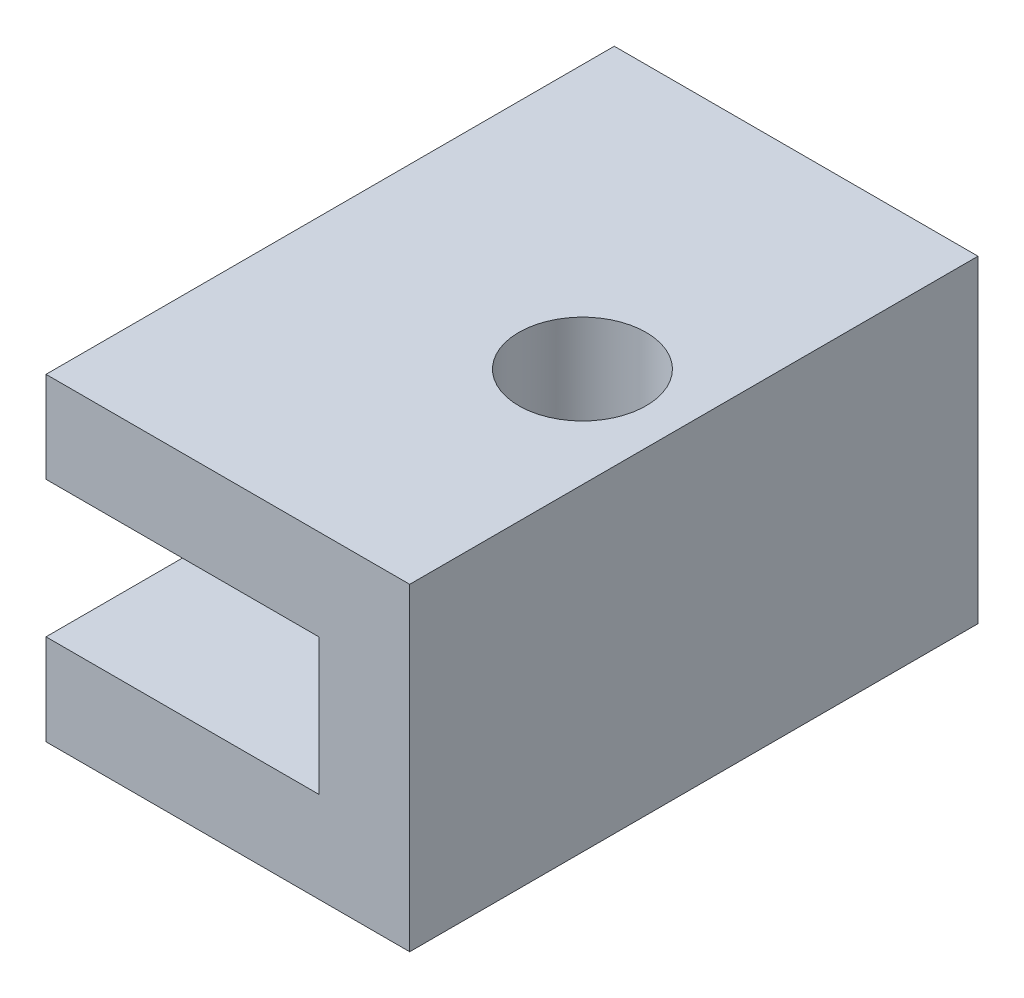
ISO-10303-21;
HEADER;
FILE_DESCRIPTION(('STEP AP214'),'2;1');
FILE_NAME('part.step','',(''),(''),'','','');
FILE_SCHEMA(('AUTOMOTIVE_DESIGN { 1 0 10303 214 1 1 1 1 }'));
ENDSEC;
DATA;
#1=APPLICATION_CONTEXT('core data for automotive mechanical design processes');
#2=APPLICATION_PROTOCOL_DEFINITION('international standard','automotive_design',2000,#1);
#3=PRODUCT_CONTEXT('',#1,'mechanical');
#4=PRODUCT('Part','Part','',(#3));
#5=PRODUCT_RELATED_PRODUCT_CATEGORY('part','',(#4));
#6=PRODUCT_DEFINITION_FORMATION('','',#4);
#7=PRODUCT_DEFINITION_CONTEXT('part definition',#1,'design');
#8=PRODUCT_DEFINITION('design','',#6,#7);
#9=PRODUCT_DEFINITION_SHAPE('','',#8);
#10=(LENGTH_UNIT() NAMED_UNIT(*) SI_UNIT(.MILLI.,.METRE.));
#11=(NAMED_UNIT(*) PLANE_ANGLE_UNIT() SI_UNIT($,.RADIAN.));
#12=(NAMED_UNIT(*) SI_UNIT($,.STERADIAN.) SOLID_ANGLE_UNIT());
#13=UNCERTAINTY_MEASURE_WITH_UNIT(LENGTH_MEASURE(1.E-05),#10,'distance_accuracy_value','');
#14=(GEOMETRIC_REPRESENTATION_CONTEXT(3) GLOBAL_UNCERTAINTY_ASSIGNED_CONTEXT((#13)) GLOBAL_UNIT_ASSIGNED_CONTEXT((#10,
#11,#12)) REPRESENTATION_CONTEXT('',''));
#15=CARTESIAN_POINT('',(0.,0.,0.));
#16=DIRECTION('',(0.,0.,1.));
#17=DIRECTION('',(1.,0.,0.));
#18=AXIS2_PLACEMENT_3D('',#15,#16,#17);
#19=CARTESIAN_POINT('',(6.,5.,12.5));
#20=DIRECTION('',(1.,0.,0.));
#21=DIRECTION('',(0.,0.,-1.));
#22=AXIS2_PLACEMENT_3D('',#19,#20,#21);
#23=PLANE('',#22);
#24=DIRECTION('',(0.,0.,-1.));
#25=VECTOR('',#24,1.);
#26=CARTESIAN_POINT('',(6.,2.,12.5));
#27=LINE('',#26,#25);
#28=CARTESIAN_POINT('',(6.,2.,5.1143593539449));
#29=VERTEX_POINT('',#28);
#30=CARTESIAN_POINT('',(6.,2.,0.));
#31=VERTEX_POINT('',#30);
#32=EDGE_CURVE('E164',#29,#31,#27,.T.);
#33=ORIENTED_EDGE('',*,*,#32,.F.);
#34=DIRECTION('',(0.,1.,0.));
#35=VECTOR('',#34,1.);
#36=CARTESIAN_POINT('',(6.,0.,5.1143593539449));
#37=LINE('',#36,#35);
#38=CARTESIAN_POINT('',(6.,5.,5.1143593539449));
#39=VERTEX_POINT('',#38);
#40=EDGE_CURVE('E48',#29,#39,#37,.T.);
#41=ORIENTED_EDGE('',*,*,#40,.T.);
#42=DIRECTION('',(0.,0.,-1.));
#43=VECTOR('',#42,1.);
#44=CARTESIAN_POINT('',(6.,5.,12.5));
#45=LINE('',#44,#43);
#46=CARTESIAN_POINT('',(6.,5.,0.));
#47=VERTEX_POINT('',#46);
#48=EDGE_CURVE('E134',#39,#47,#45,.T.);
#49=ORIENTED_EDGE('',*,*,#48,.T.);
#50=DIRECTION('',(0.,-1.,0.));
#51=VECTOR('',#50,1.);
#52=CARTESIAN_POINT('',(6.,5.,0.));
#53=LINE('',#52,#51);
#54=EDGE_CURVE('E158',#47,#31,#53,.T.);
#55=ORIENTED_EDGE('',*,*,#54,.T.);
#56=EDGE_LOOP('',(#33,#41,#49,#55));
#57=FACE_BOUND('',#56,.T.);
#58=ADVANCED_FACE('F33',(#57),#23,.F.);
#59=CARTESIAN_POINT('',(0.,2.,12.5));
#60=DIRECTION('',(1.,0.,0.));
#61=DIRECTION('',(0.,1.,0.));
#62=AXIS2_PLACEMENT_3D('',#59,#60,#61);
#63=PLANE('',#62);
#64=DIRECTION('',(0.,-1.,0.));
#65=VECTOR('',#64,1.);
#66=CARTESIAN_POINT('',(0.,2.,0.));
#67=LINE('',#66,#65);
#68=CARTESIAN_POINT('',(0.,2.,0.));
#69=VERTEX_POINT('',#68);
#70=CARTESIAN_POINT('',(0.,0.,0.));
#71=VERTEX_POINT('',#70);
#72=EDGE_CURVE('E144',#69,#71,#67,.T.);
#73=ORIENTED_EDGE('',*,*,#72,.T.);
#74=DIRECTION('',(0.,0.,-1.));
#75=VECTOR('',#74,1.);
#76=CARTESIAN_POINT('',(0.,0.,12.5));
#77=LINE('',#76,#75);
#78=CARTESIAN_POINT('',(0.,0.,12.5));
#79=VERTEX_POINT('',#78);
#80=EDGE_CURVE('E41',#79,#71,#77,.T.);
#81=ORIENTED_EDGE('',*,*,#80,.F.);
#82=DIRECTION('',(0.,-1.,0.));
#83=VECTOR('',#82,1.);
#84=CARTESIAN_POINT('',(0.,2.,12.5));
#85=LINE('',#84,#83);
#86=CARTESIAN_POINT('',(0.,2.,12.5));
#87=VERTEX_POINT('',#86);
#88=EDGE_CURVE('E162',#87,#79,#85,.T.);
#89=ORIENTED_EDGE('',*,*,#88,.F.);
#90=DIRECTION('',(0.,0.,-1.));
#91=VECTOR('',#90,1.);
#92=CARTESIAN_POINT('',(0.,2.,12.5));
#93=LINE('',#92,#91);
#94=EDGE_CURVE('E140',#87,#69,#93,.T.);
#95=ORIENTED_EDGE('',*,*,#94,.T.);
#96=EDGE_LOOP('',(#73,#81,#89,#95));
#97=FACE_BOUND('',#96,.T.);
#98=ADVANCED_FACE('F35',(#97),#63,.F.);
#99=CARTESIAN_POINT('',(0.,0.,12.5));
#100=DIRECTION('',(0.,1.,0.));
#101=DIRECTION('',(0.,0.,1.));
#102=AXIS2_PLACEMENT_3D('',#99,#100,#101);
#103=PLANE('',#102);
#104=CARTESIAN_POINT('',(5.79999999999999,0.,6.5));
#105=DIRECTION('',(0.,1.,0.));
#106=DIRECTION('',(-1.,0.,0.));
#107=AXIS2_PLACEMENT_3D('',#104,#105,#106);
#108=CIRCLE('',#107,1.4);
#109=CARTESIAN_POINT('',(4.39999999999999,0.,6.5));
#110=VERTEX_POINT('',#109);
#111=EDGE_CURVE('E205',#110,#110,#108,.T.);
#112=ORIENTED_EDGE('',*,*,#111,.T.);
#113=EDGE_LOOP('',(#112));
#114=FACE_BOUND('',#113,.T.);
#115=DIRECTION('',(1.,0.,0.));
#116=VECTOR('',#115,1.);
#117=CARTESIAN_POINT('',(0.,0.,0.));
#118=LINE('',#117,#116);
#119=CARTESIAN_POINT('',(8.,0.,0.));
#120=VERTEX_POINT('',#119);
#121=EDGE_CURVE('E147',#71,#120,#118,.T.);
#122=ORIENTED_EDGE('',*,*,#121,.T.);
#123=DIRECTION('',(0.,0.,-1.));
#124=VECTOR('',#123,1.);
#125=CARTESIAN_POINT('',(8.,0.,12.5));
#126=LINE('',#125,#124);
#127=CARTESIAN_POINT('',(8.,0.,12.5));
#128=VERTEX_POINT('',#127);
#129=EDGE_CURVE('E173',#128,#120,#126,.T.);
#130=ORIENTED_EDGE('',*,*,#129,.F.);
#131=DIRECTION('',(1.,0.,0.));
#132=VECTOR('',#131,1.);
#133=CARTESIAN_POINT('',(0.,0.,12.5));
#134=LINE('',#133,#132);
#135=EDGE_CURVE('E97',#79,#128,#134,.T.);
#136=ORIENTED_EDGE('',*,*,#135,.F.);
#137=ORIENTED_EDGE('',*,*,#80,.T.);
#138=EDGE_LOOP('',(#122,#130,#136,#137));
#139=FACE_BOUND('',#138,.T.);
#140=ADVANCED_FACE('F176',(#114,#139),#103,.F.);
#141=CARTESIAN_POINT('',(8.,0.,12.5));
#142=DIRECTION('',(-1.,0.,0.));
#143=DIRECTION('',(0.,-1.,0.));
#144=AXIS2_PLACEMENT_3D('',#141,#142,#143);
#145=PLANE('',#144);
#146=DIRECTION('',(0.,1.,0.));
#147=VECTOR('',#146,1.);
#148=CARTESIAN_POINT('',(8.,0.,0.));
#149=LINE('',#148,#147);
#150=CARTESIAN_POINT('',(8.,7.,0.));
#151=VERTEX_POINT('',#150);
#152=EDGE_CURVE('E149',#120,#151,#149,.T.);
#153=ORIENTED_EDGE('',*,*,#152,.T.);
#154=DIRECTION('',(0.,0.,-1.));
#155=VECTOR('',#154,1.);
#156=CARTESIAN_POINT('',(8.,7.,12.5));
#157=LINE('',#156,#155);
#158=CARTESIAN_POINT('',(8.,7.,12.5));
#159=VERTEX_POINT('',#158);
#160=EDGE_CURVE('E170',#159,#151,#157,.T.);
#161=ORIENTED_EDGE('',*,*,#160,.F.);
#162=DIRECTION('',(0.,1.,0.));
#163=VECTOR('',#162,1.);
#164=CARTESIAN_POINT('',(8.,0.,12.5));
#165=LINE('',#164,#163);
#166=EDGE_CURVE('E195',#128,#159,#165,.T.);
#167=ORIENTED_EDGE('',*,*,#166,.F.);
#168=ORIENTED_EDGE('',*,*,#129,.T.);
#169=EDGE_LOOP('',(#153,#161,#167,#168));
#170=FACE_BOUND('',#169,.T.);
#171=ADVANCED_FACE('F188',(#170),#145,.F.);
#172=CARTESIAN_POINT('',(8.,7.,12.5));
#173=DIRECTION('',(0.,-1.,0.));
#174=DIRECTION('',(1.,0.,0.));
#175=AXIS2_PLACEMENT_3D('',#172,#173,#174);
#176=PLANE('',#175);
#177=CARTESIAN_POINT('',(5.79999999999999,7.,6.5));
#178=DIRECTION('',(0.,1.,0.));
#179=DIRECTION('',(-1.,0.,0.));
#180=AXIS2_PLACEMENT_3D('',#177,#178,#179);
#181=CIRCLE('',#180,1.4);
#182=CARTESIAN_POINT('',(4.39999999999999,7.,6.5));
#183=VERTEX_POINT('',#182);
#184=EDGE_CURVE('E206',#183,#183,#181,.T.);
#185=ORIENTED_EDGE('',*,*,#184,.F.);
#186=EDGE_LOOP('',(#185));
#187=FACE_BOUND('',#186,.T.);
#188=DIRECTION('',(-1.,0.,0.));
#189=VECTOR('',#188,1.);
#190=CARTESIAN_POINT('',(8.,7.,0.));
#191=LINE('',#190,#189);
#192=CARTESIAN_POINT('',(0.,7.,0.));
#193=VERTEX_POINT('',#192);
#194=EDGE_CURVE('E151',#151,#193,#191,.T.);
#195=ORIENTED_EDGE('',*,*,#194,.T.);
#196=DIRECTION('',(0.,0.,-1.));
#197=VECTOR('',#196,1.);
#198=CARTESIAN_POINT('',(0.,7.,12.5));
#199=LINE('',#198,#197);
#200=CARTESIAN_POINT('',(0.,7.,12.5));
#201=VERTEX_POINT('',#200);
#202=EDGE_CURVE('E167',#201,#193,#199,.T.);
#203=ORIENTED_EDGE('',*,*,#202,.F.);
#204=DIRECTION('',(-1.,0.,0.));
#205=VECTOR('',#204,1.);
#206=CARTESIAN_POINT('',(8.,7.,12.5));
#207=LINE('',#206,#205);
#208=EDGE_CURVE('E194',#159,#201,#207,.T.);
#209=ORIENTED_EDGE('',*,*,#208,.F.);
#210=ORIENTED_EDGE('',*,*,#160,.T.);
#211=EDGE_LOOP('',(#195,#203,#209,#210));
#212=FACE_BOUND('',#211,.T.);
#213=ADVANCED_FACE('F192',(#187,#212),#176,.F.);
#214=CARTESIAN_POINT('',(0.,7.,12.5));
#215=DIRECTION('',(1.,0.,0.));
#216=DIRECTION('',(0.,1.,0.));
#217=AXIS2_PLACEMENT_3D('',#214,#215,#216);
#218=PLANE('',#217);
#219=DIRECTION('',(0.,-1.,0.));
#220=VECTOR('',#219,1.);
#221=CARTESIAN_POINT('',(0.,7.,0.));
#222=LINE('',#221,#220);
#223=CARTESIAN_POINT('',(0.,5.,0.));
#224=VERTEX_POINT('',#223);
#225=EDGE_CURVE('E153',#193,#224,#222,.T.);
#226=ORIENTED_EDGE('',*,*,#225,.T.);
#227=DIRECTION('',(0.,0.,-1.));
#228=VECTOR('',#227,1.);
#229=CARTESIAN_POINT('',(0.,5.,12.5));
#230=LINE('',#229,#228);
#231=CARTESIAN_POINT('',(0.,5.,12.5));
#232=VERTEX_POINT('',#231);
#233=EDGE_CURVE('E133',#232,#224,#230,.T.);
#234=ORIENTED_EDGE('',*,*,#233,.F.);
#235=DIRECTION('',(0.,-1.,0.));
#236=VECTOR('',#235,1.);
#237=CARTESIAN_POINT('',(0.,7.,12.5));
#238=LINE('',#237,#236);
#239=EDGE_CURVE('E119',#201,#232,#238,.T.);
#240=ORIENTED_EDGE('',*,*,#239,.F.);
#241=ORIENTED_EDGE('',*,*,#202,.T.);
#242=EDGE_LOOP('',(#226,#234,#240,#241));
#243=FACE_BOUND('',#242,.T.);
#244=ADVANCED_FACE('F220',(#243),#218,.F.);
#245=CARTESIAN_POINT('',(0.,5.,12.5));
#246=DIRECTION('',(0.,1.,0.));
#247=DIRECTION('',(0.,0.,1.));
#248=AXIS2_PLACEMENT_3D('',#245,#246,#247);
#249=PLANE('',#248);
#250=ORIENTED_EDGE('',*,*,#48,.F.);
#251=CARTESIAN_POINT('',(5.79999999999999,5.,6.5));
#252=DIRECTION('',(0.,1.,0.));
#253=DIRECTION('',(0.,0.,1.));
#254=AXIS2_PLACEMENT_3D('',#251,#252,#253);
#255=CIRCLE('',#254,1.4);
#256=CARTESIAN_POINT('',(6.,5.,7.8856406460551));
#257=VERTEX_POINT('',#256);
#258=EDGE_CURVE('E130',#39,#257,#255,.T.);
#259=ORIENTED_EDGE('',*,*,#258,.T.);
#260=CARTESIAN_POINT('',(6.,5.,12.5));
#261=VERTEX_POINT('',#260);
#262=EDGE_CURVE('E126',#261,#257,#45,.T.);
#263=ORIENTED_EDGE('',*,*,#262,.F.);
#264=DIRECTION('',(1.,0.,0.));
#265=VECTOR('',#264,1.);
#266=CARTESIAN_POINT('',(0.,5.,12.5));
#267=LINE('',#266,#265);
#268=EDGE_CURVE('E112',#232,#261,#267,.T.);
#269=ORIENTED_EDGE('',*,*,#268,.F.);
#270=ORIENTED_EDGE('',*,*,#233,.T.);
#271=DIRECTION('',(1.,0.,0.));
#272=VECTOR('',#271,1.);
#273=CARTESIAN_POINT('',(0.,5.,0.));
#274=LINE('',#273,#272);
#275=EDGE_CURVE('E155',#224,#47,#274,.T.);
#276=ORIENTED_EDGE('',*,*,#275,.T.);
#277=EDGE_LOOP('',(#250,#259,#263,#269,#270,#276));
#278=FACE_BOUND('',#277,.T.);
#279=ADVANCED_FACE('F128',(#278),#249,.F.);
#280=ORIENTED_EDGE('',*,*,#262,.T.);
#281=DIRECTION('',(0.,1.,0.));
#282=VECTOR('',#281,1.);
#283=CARTESIAN_POINT('',(6.,0.,7.8856406460551));
#284=LINE('',#283,#282);
#285=CARTESIAN_POINT('',(6.,2.,7.8856406460551));
#286=VERTEX_POINT('',#285);
#287=EDGE_CURVE('E203',#257,#286,#284,.F.);
#288=ORIENTED_EDGE('',*,*,#287,.T.);
#289=CARTESIAN_POINT('',(6.,2.,12.5));
#290=VERTEX_POINT('',#289);
#291=EDGE_CURVE('E138',#290,#286,#27,.T.);
#292=ORIENTED_EDGE('',*,*,#291,.F.);
#293=DIRECTION('',(0.,-1.,0.));
#294=VECTOR('',#293,1.);
#295=CARTESIAN_POINT('',(6.,5.,12.5));
#296=LINE('',#295,#294);
#297=EDGE_CURVE('E116',#261,#290,#296,.T.);
#298=ORIENTED_EDGE('',*,*,#297,.F.);
#299=EDGE_LOOP('',(#280,#288,#292,#298));
#300=FACE_BOUND('',#299,.T.);
#301=ADVANCED_FACE('F136',(#300),#23,.F.);
#302=CARTESIAN_POINT('',(6.,2.,12.5));
#303=DIRECTION('',(0.,-1.,0.));
#304=DIRECTION('',(1.,0.,0.));
#305=AXIS2_PLACEMENT_3D('',#302,#303,#304);
#306=PLANE('',#305);
#307=ORIENTED_EDGE('',*,*,#291,.T.);
#308=CARTESIAN_POINT('',(5.79999999999999,2.,6.5));
#309=DIRECTION('',(0.,-1.,0.));
#310=DIRECTION('',(1.,0.,0.));
#311=AXIS2_PLACEMENT_3D('',#308,#309,#310);
#312=CIRCLE('',#311,1.4);
#313=EDGE_CURVE('E11',#286,#29,#312,.T.);
#314=ORIENTED_EDGE('',*,*,#313,.T.);
#315=ORIENTED_EDGE('',*,*,#32,.T.);
#316=DIRECTION('',(-1.,0.,0.));
#317=VECTOR('',#316,1.);
#318=CARTESIAN_POINT('',(6.,2.,0.));
#319=LINE('',#318,#317);
#320=EDGE_CURVE('E88',#31,#69,#319,.T.);
#321=ORIENTED_EDGE('',*,*,#320,.T.);
#322=ORIENTED_EDGE('',*,*,#94,.F.);
#323=DIRECTION('',(-1.,0.,0.));
#324=VECTOR('',#323,1.);
#325=CARTESIAN_POINT('',(6.,2.,12.5));
#326=LINE('',#325,#324);
#327=EDGE_CURVE('E56',#290,#87,#326,.T.);
#328=ORIENTED_EDGE('',*,*,#327,.F.);
#329=EDGE_LOOP('',(#307,#314,#315,#321,#322,#328));
#330=FACE_BOUND('',#329,.T.);
#331=ADVANCED_FACE('F239',(#330),#306,.F.);
#332=CARTESIAN_POINT('',(0.,0.,12.5));
#333=DIRECTION('',(0.,0.,1.));
#334=DIRECTION('',(1.,0.,0.));
#335=AXIS2_PLACEMENT_3D('',#332,#333,#334);
#336=PLANE('',#335);
#337=ORIENTED_EDGE('',*,*,#88,.T.);
#338=ORIENTED_EDGE('',*,*,#135,.T.);
#339=ORIENTED_EDGE('',*,*,#166,.T.);
#340=ORIENTED_EDGE('',*,*,#208,.T.);
#341=ORIENTED_EDGE('',*,*,#239,.T.);
#342=ORIENTED_EDGE('',*,*,#268,.T.);
#343=ORIENTED_EDGE('',*,*,#297,.T.);
#344=ORIENTED_EDGE('',*,*,#327,.T.);
#345=EDGE_LOOP('',(#337,#338,#339,#340,#341,#342,#343,#344));
#346=FACE_BOUND('',#345,.T.);
#347=ADVANCED_FACE('F114',(#346),#336,.T.);
#348=CARTESIAN_POINT('',(0.,0.,0.));
#349=DIRECTION('',(0.,0.,1.));
#350=DIRECTION('',(1.,0.,0.));
#351=AXIS2_PLACEMENT_3D('',#348,#349,#350);
#352=PLANE('',#351);
#353=ORIENTED_EDGE('',*,*,#72,.F.);
#354=ORIENTED_EDGE('',*,*,#320,.F.);
#355=ORIENTED_EDGE('',*,*,#54,.F.);
#356=ORIENTED_EDGE('',*,*,#275,.F.);
#357=ORIENTED_EDGE('',*,*,#225,.F.);
#358=ORIENTED_EDGE('',*,*,#194,.F.);
#359=ORIENTED_EDGE('',*,*,#152,.F.);
#360=ORIENTED_EDGE('',*,*,#121,.F.);
#361=EDGE_LOOP('',(#353,#354,#355,#356,#357,#358,#359,#360));
#362=FACE_BOUND('',#361,.T.);
#363=ADVANCED_FACE('F181',(#362),#352,.F.);
#364=CARTESIAN_POINT('',(5.79999999999999,0.,6.5));
#365=DIRECTION('',(0.,1.,0.));
#366=DIRECTION('',(-1.,0.,0.));
#367=AXIS2_PLACEMENT_3D('',#364,#365,#366);
#368=CYLINDRICAL_SURFACE('',#367,1.4);
#369=ORIENTED_EDGE('',*,*,#111,.F.);
#370=EDGE_LOOP('',(#369));
#371=FACE_BOUND('',#370,.T.);
#372=ORIENTED_EDGE('',*,*,#184,.T.);
#373=EDGE_LOOP('',(#372));
#374=FACE_BOUND('',#373,.T.);
#375=ORIENTED_EDGE('',*,*,#40,.F.);
#376=ORIENTED_EDGE('',*,*,#313,.F.);
#377=ORIENTED_EDGE('',*,*,#287,.F.);
#378=ORIENTED_EDGE('',*,*,#258,.F.);
#379=EDGE_LOOP('',(#375,#376,#377,#378));
#380=FACE_BOUND('',#379,.T.);
#381=ADVANCED_FACE('F213',(#371,#374,#380),#368,.F.);
#382=CLOSED_SHELL('',(#58,#98,#140,#171,#213,#244,#279,#301,#331,#347,#363,#381));
#383=MANIFOLD_SOLID_BREP('B2',#382);
#384=ADVANCED_BREP_SHAPE_REPRESENTATION('',(#18,#383),#14);
#385=SHAPE_DEFINITION_REPRESENTATION(#9,#384);
ENDSEC;
END-ISO-10303-21;
